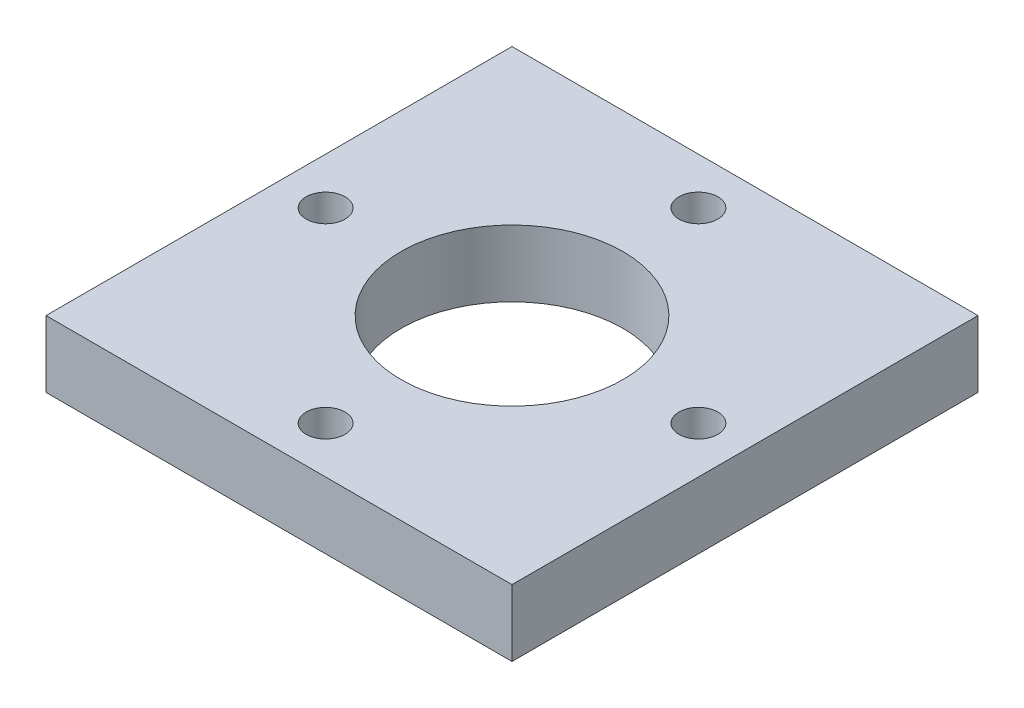
ISO-10303-21;
HEADER;
FILE_DESCRIPTION(('STEP AP214'),'2;1');
FILE_NAME('part.step','',(''),(''),'','','');
FILE_SCHEMA(('AUTOMOTIVE_DESIGN { 1 0 10303 214 1 1 1 1 }'));
ENDSEC;
DATA;
#1=APPLICATION_CONTEXT('core data for automotive mechanical design processes');
#2=APPLICATION_PROTOCOL_DEFINITION('international standard','automotive_design',2000,#1);
#3=PRODUCT_CONTEXT('',#1,'mechanical');
#4=PRODUCT('Part','Part','',(#3));
#5=PRODUCT_RELATED_PRODUCT_CATEGORY('part','',(#4));
#6=PRODUCT_DEFINITION_FORMATION('','',#4);
#7=PRODUCT_DEFINITION_CONTEXT('part definition',#1,'design');
#8=PRODUCT_DEFINITION('design','',#6,#7);
#9=PRODUCT_DEFINITION_SHAPE('','',#8);
#10=(LENGTH_UNIT() NAMED_UNIT(*) SI_UNIT(.MILLI.,.METRE.));
#11=(NAMED_UNIT(*) PLANE_ANGLE_UNIT() SI_UNIT($,.RADIAN.));
#12=(NAMED_UNIT(*) SI_UNIT($,.STERADIAN.) SOLID_ANGLE_UNIT());
#13=UNCERTAINTY_MEASURE_WITH_UNIT(LENGTH_MEASURE(1.E-05),#10,'distance_accuracy_value','');
#14=(GEOMETRIC_REPRESENTATION_CONTEXT(3) GLOBAL_UNCERTAINTY_ASSIGNED_CONTEXT((#13)) GLOBAL_UNIT_ASSIGNED_CONTEXT((#10,
#11,#12)) REPRESENTATION_CONTEXT('',''));
#15=CARTESIAN_POINT('',(0.,0.,0.));
#16=DIRECTION('',(0.,0.,1.));
#17=DIRECTION('',(1.,0.,0.));
#18=AXIS2_PLACEMENT_3D('',#15,#16,#17);
#19=CARTESIAN_POINT('',(0.,9.525,0.));
#20=DIRECTION('',(0.,-1.,0.));
#21=DIRECTION('',(0.,0.,-1.));
#22=AXIS2_PLACEMENT_3D('',#19,#20,#21);
#23=PLANE('',#22);
#24=CARTESIAN_POINT('',(1.5094817149911E-12,9.525,26.67));
#25=DIRECTION('',(0.,1.,0.));
#26=DIRECTION('',(0.,0.,1.));
#27=AXIS2_PLACEMENT_3D('',#24,#25,#26);
#28=CIRCLE('',#27,2.77876000000162);
#29=CARTESIAN_POINT('',(1.5094817149911E-12,9.525,23.8912399999984));
#30=VERTEX_POINT('',#29);
#31=EDGE_CURVE('E139',#30,#30,#28,.T.);
#32=ORIENTED_EDGE('',*,*,#31,.F.);
#33=EDGE_LOOP('',(#32));
#34=FACE_BOUND('',#33,.T.);
#35=CARTESIAN_POINT('',(0.,9.525,-26.67));
#36=DIRECTION('',(0.,1.,0.));
#37=DIRECTION('',(0.,0.,1.));
#38=AXIS2_PLACEMENT_3D('',#35,#36,#37);
#39=CIRCLE('',#38,2.77876);
#40=CARTESIAN_POINT('',(0.,9.525,-29.44876));
#41=VERTEX_POINT('',#40);
#42=EDGE_CURVE('E127',#41,#41,#39,.T.);
#43=ORIENTED_EDGE('',*,*,#42,.F.);
#44=EDGE_LOOP('',(#43));
#45=FACE_BOUND('',#44,.T.);
#46=DIRECTION('',(0.,0.,-1.));
#47=VECTOR('',#46,1.);
#48=CARTESIAN_POINT('',(33.3375,9.525,33.3375));
#49=LINE('',#48,#47);
#50=CARTESIAN_POINT('',(33.3375,9.525,33.3375));
#51=VERTEX_POINT('',#50);
#52=CARTESIAN_POINT('',(33.3375,9.525,-33.3375));
#53=VERTEX_POINT('',#52);
#54=EDGE_CURVE('E97',#51,#53,#49,.T.);
#55=ORIENTED_EDGE('',*,*,#54,.T.);
#56=DIRECTION('',(-1.,0.,0.));
#57=VECTOR('',#56,1.);
#58=CARTESIAN_POINT('',(-33.3375,9.525,-33.3375));
#59=LINE('',#58,#57);
#60=CARTESIAN_POINT('',(-33.3375,9.525,-33.3375));
#61=VERTEX_POINT('',#60);
#62=EDGE_CURVE('E92',#53,#61,#59,.T.);
#63=ORIENTED_EDGE('',*,*,#62,.T.);
#64=DIRECTION('',(0.,0.,1.));
#65=VECTOR('',#64,1.);
#66=CARTESIAN_POINT('',(-33.3375,9.525,33.3375));
#67=LINE('',#66,#65);
#68=CARTESIAN_POINT('',(-33.3375,9.525,33.3375));
#69=VERTEX_POINT('',#68);
#70=EDGE_CURVE('E95',#61,#69,#67,.T.);
#71=ORIENTED_EDGE('',*,*,#70,.T.);
#72=DIRECTION('',(1.,0.,0.));
#73=VECTOR('',#72,1.);
#74=CARTESIAN_POINT('',(-33.3375,9.525,33.3375));
#75=LINE('',#74,#73);
#76=EDGE_CURVE('E62',#69,#51,#75,.T.);
#77=ORIENTED_EDGE('',*,*,#76,.T.);
#78=EDGE_LOOP('',(#55,#63,#71,#77));
#79=FACE_BOUND('',#78,.T.);
#80=CARTESIAN_POINT('',(0.,9.525,0.));
#81=DIRECTION('',(0.,1.,0.));
#82=DIRECTION('',(0.,0.,1.));
#83=AXIS2_PLACEMENT_3D('',#80,#81,#82);
#84=CIRCLE('',#83,15.875);
#85=CARTESIAN_POINT('',(0.,9.525,-15.875));
#86=VERTEX_POINT('',#85);
#87=EDGE_CURVE('E112',#86,#86,#84,.T.);
#88=ORIENTED_EDGE('',*,*,#87,.F.);
#89=EDGE_LOOP('',(#88));
#90=FACE_BOUND('',#89,.T.);
#91=CARTESIAN_POINT('',(26.6700000000008,9.525,-7.54740857495549E-13));
#92=DIRECTION('',(0.,1.,0.));
#93=DIRECTION('',(0.,0.,1.));
#94=AXIS2_PLACEMENT_3D('',#91,#92,#93);
#95=CIRCLE('',#94,2.77876000000059);
#96=CARTESIAN_POINT('',(26.6700000000008,9.525,-2.77876000000134));
#97=VERTEX_POINT('',#96);
#98=EDGE_CURVE('E133',#97,#97,#95,.T.);
#99=ORIENTED_EDGE('',*,*,#98,.F.);
#100=EDGE_LOOP('',(#99));
#101=FACE_BOUND('',#100,.T.);
#102=CARTESIAN_POINT('',(-26.6699999999992,9.525,7.58006990508875E-13));
#103=DIRECTION('',(0.,1.,0.));
#104=DIRECTION('',(0.,0.,1.));
#105=AXIS2_PLACEMENT_3D('',#102,#103,#104);
#106=CIRCLE('',#105,2.77876000000121);
#107=CARTESIAN_POINT('',(-26.6699999999992,9.525,-2.77876000000046));
#108=VERTEX_POINT('',#107);
#109=EDGE_CURVE('E145',#108,#108,#106,.T.);
#110=ORIENTED_EDGE('',*,*,#109,.F.);
#111=EDGE_LOOP('',(#110));
#112=FACE_BOUND('',#111,.T.);
#113=ADVANCED_FACE('F45',(#34,#45,#79,#90,#101,#112),#23,.F.);
#114=CARTESIAN_POINT('',(0.,0.,0.));
#115=DIRECTION('',(0.,-1.,0.));
#116=DIRECTION('',(0.,0.,-1.));
#117=AXIS2_PLACEMENT_3D('',#114,#115,#116);
#118=PLANE('',#117);
#119=CARTESIAN_POINT('',(1.5094817149911E-12,0.,26.67));
#120=DIRECTION('',(0.,1.,0.));
#121=DIRECTION('',(0.,0.,1.));
#122=AXIS2_PLACEMENT_3D('',#119,#120,#121);
#123=CIRCLE('',#122,2.77876000000162);
#124=CARTESIAN_POINT('',(1.5094817149911E-12,0.,23.8912399999984));
#125=VERTEX_POINT('',#124);
#126=EDGE_CURVE('E142',#125,#125,#123,.T.);
#127=ORIENTED_EDGE('',*,*,#126,.T.);
#128=EDGE_LOOP('',(#127));
#129=FACE_BOUND('',#128,.T.);
#130=CARTESIAN_POINT('',(0.,0.,-26.67));
#131=DIRECTION('',(0.,1.,0.));
#132=DIRECTION('',(0.,0.,1.));
#133=AXIS2_PLACEMENT_3D('',#130,#131,#132);
#134=CIRCLE('',#133,2.77876);
#135=CARTESIAN_POINT('',(0.,0.,-29.44876));
#136=VERTEX_POINT('',#135);
#137=EDGE_CURVE('E130',#136,#136,#134,.T.);
#138=ORIENTED_EDGE('',*,*,#137,.T.);
#139=EDGE_LOOP('',(#138));
#140=FACE_BOUND('',#139,.T.);
#141=DIRECTION('',(0.,0.,-1.));
#142=VECTOR('',#141,1.);
#143=CARTESIAN_POINT('',(33.3375,0.,33.3375));
#144=LINE('',#143,#142);
#145=CARTESIAN_POINT('',(33.3375,0.,33.3375));
#146=VERTEX_POINT('',#145);
#147=CARTESIAN_POINT('',(33.3375,0.,-33.3375));
#148=VERTEX_POINT('',#147);
#149=EDGE_CURVE('E109',#146,#148,#144,.T.);
#150=ORIENTED_EDGE('',*,*,#149,.F.);
#151=DIRECTION('',(1.,0.,0.));
#152=VECTOR('',#151,1.);
#153=CARTESIAN_POINT('',(-33.3375,0.,33.3375));
#154=LINE('',#153,#152);
#155=CARTESIAN_POINT('',(-33.3375,0.,33.3375));
#156=VERTEX_POINT('',#155);
#157=EDGE_CURVE('E85',#156,#146,#154,.T.);
#158=ORIENTED_EDGE('',*,*,#157,.F.);
#159=DIRECTION('',(0.,0.,1.));
#160=VECTOR('',#159,1.);
#161=CARTESIAN_POINT('',(-33.3375,0.,33.3375));
#162=LINE('',#161,#160);
#163=CARTESIAN_POINT('',(-33.3375,0.,-33.3375));
#164=VERTEX_POINT('',#163);
#165=EDGE_CURVE('E79',#164,#156,#162,.T.);
#166=ORIENTED_EDGE('',*,*,#165,.F.);
#167=DIRECTION('',(-1.,0.,0.));
#168=VECTOR('',#167,1.);
#169=CARTESIAN_POINT('',(-33.3375,0.,-33.3375));
#170=LINE('',#169,#168);
#171=EDGE_CURVE('E101',#148,#164,#170,.T.);
#172=ORIENTED_EDGE('',*,*,#171,.F.);
#173=EDGE_LOOP('',(#150,#158,#166,#172));
#174=FACE_BOUND('',#173,.T.);
#175=CARTESIAN_POINT('',(0.,0.,0.));
#176=DIRECTION('',(0.,1.,0.));
#177=DIRECTION('',(0.,0.,1.));
#178=AXIS2_PLACEMENT_3D('',#175,#176,#177);
#179=CIRCLE('',#178,15.875);
#180=CARTESIAN_POINT('',(0.,0.,-15.875));
#181=VERTEX_POINT('',#180);
#182=EDGE_CURVE('E124',#181,#181,#179,.T.);
#183=ORIENTED_EDGE('',*,*,#182,.T.);
#184=EDGE_LOOP('',(#183));
#185=FACE_BOUND('',#184,.T.);
#186=CARTESIAN_POINT('',(26.6700000000008,0.,-7.54740857495549E-13));
#187=DIRECTION('',(0.,1.,0.));
#188=DIRECTION('',(0.,0.,1.));
#189=AXIS2_PLACEMENT_3D('',#186,#187,#188);
#190=CIRCLE('',#189,2.77876000000059);
#191=CARTESIAN_POINT('',(26.6700000000008,0.,-2.77876000000134));
#192=VERTEX_POINT('',#191);
#193=EDGE_CURVE('E136',#192,#192,#190,.T.);
#194=ORIENTED_EDGE('',*,*,#193,.T.);
#195=EDGE_LOOP('',(#194));
#196=FACE_BOUND('',#195,.T.);
#197=CARTESIAN_POINT('',(-26.6699999999992,0.,7.58006990508875E-13));
#198=DIRECTION('',(0.,1.,0.));
#199=DIRECTION('',(0.,0.,1.));
#200=AXIS2_PLACEMENT_3D('',#197,#198,#199);
#201=CIRCLE('',#200,2.77876000000121);
#202=CARTESIAN_POINT('',(-26.6699999999992,0.,-2.77876000000046));
#203=VERTEX_POINT('',#202);
#204=EDGE_CURVE('E148',#203,#203,#201,.T.);
#205=ORIENTED_EDGE('',*,*,#204,.T.);
#206=EDGE_LOOP('',(#205));
#207=FACE_BOUND('',#206,.T.);
#208=ADVANCED_FACE('F120',(#129,#140,#174,#185,#196,#207),#118,.T.);
#209=CARTESIAN_POINT('',(33.3375,9.525,33.3375));
#210=DIRECTION('',(-1.,0.,0.));
#211=DIRECTION('',(0.,0.,1.));
#212=AXIS2_PLACEMENT_3D('',#209,#210,#211);
#213=PLANE('',#212);
#214=ORIENTED_EDGE('',*,*,#149,.T.);
#215=DIRECTION('',(0.,-1.,0.));
#216=VECTOR('',#215,1.);
#217=CARTESIAN_POINT('',(33.3375,9.525,-33.3375));
#218=LINE('',#217,#216);
#219=EDGE_CURVE('E13',#53,#148,#218,.T.);
#220=ORIENTED_EDGE('',*,*,#219,.F.);
#221=ORIENTED_EDGE('',*,*,#54,.F.);
#222=DIRECTION('',(0.,-1.,0.));
#223=VECTOR('',#222,1.);
#224=CARTESIAN_POINT('',(33.3375,9.525,33.3375));
#225=LINE('',#224,#223);
#226=EDGE_CURVE('E105',#51,#146,#225,.T.);
#227=ORIENTED_EDGE('',*,*,#226,.T.);
#228=EDGE_LOOP('',(#214,#220,#221,#227));
#229=FACE_BOUND('',#228,.T.);
#230=ADVANCED_FACE('F47',(#229),#213,.F.);
#231=CARTESIAN_POINT('',(-33.3375,9.525,-33.3375));
#232=DIRECTION('',(0.,0.,1.));
#233=DIRECTION('',(1.,0.,0.));
#234=AXIS2_PLACEMENT_3D('',#231,#232,#233);
#235=PLANE('',#234);
#236=ORIENTED_EDGE('',*,*,#171,.T.);
#237=DIRECTION('',(0.,-1.,0.));
#238=VECTOR('',#237,1.);
#239=CARTESIAN_POINT('',(-33.3375,9.525,-33.3375));
#240=LINE('',#239,#238);
#241=EDGE_CURVE('E54',#61,#164,#240,.T.);
#242=ORIENTED_EDGE('',*,*,#241,.F.);
#243=ORIENTED_EDGE('',*,*,#62,.F.);
#244=ORIENTED_EDGE('',*,*,#219,.T.);
#245=EDGE_LOOP('',(#236,#242,#243,#244));
#246=FACE_BOUND('',#245,.T.);
#247=ADVANCED_FACE('F100',(#246),#235,.F.);
#248=CARTESIAN_POINT('',(-33.3375,9.525,33.3375));
#249=DIRECTION('',(1.,0.,0.));
#250=DIRECTION('',(0.,0.,-1.));
#251=AXIS2_PLACEMENT_3D('',#248,#249,#250);
#252=PLANE('',#251);
#253=ORIENTED_EDGE('',*,*,#165,.T.);
#254=DIRECTION('',(0.,-1.,0.));
#255=VECTOR('',#254,1.);
#256=CARTESIAN_POINT('',(-33.3375,9.525,33.3375));
#257=LINE('',#256,#255);
#258=EDGE_CURVE('E102',#69,#156,#257,.T.);
#259=ORIENTED_EDGE('',*,*,#258,.F.);
#260=ORIENTED_EDGE('',*,*,#70,.F.);
#261=ORIENTED_EDGE('',*,*,#241,.T.);
#262=EDGE_LOOP('',(#253,#259,#260,#261));
#263=FACE_BOUND('',#262,.T.);
#264=ADVANCED_FACE('F103',(#263),#252,.F.);
#265=CARTESIAN_POINT('',(-33.3375,9.525,33.3375));
#266=DIRECTION('',(0.,0.,-1.));
#267=DIRECTION('',(-1.,0.,0.));
#268=AXIS2_PLACEMENT_3D('',#265,#266,#267);
#269=PLANE('',#268);
#270=ORIENTED_EDGE('',*,*,#157,.T.);
#271=ORIENTED_EDGE('',*,*,#226,.F.);
#272=ORIENTED_EDGE('',*,*,#76,.F.);
#273=ORIENTED_EDGE('',*,*,#258,.T.);
#274=EDGE_LOOP('',(#270,#271,#272,#273));
#275=FACE_BOUND('',#274,.T.);
#276=ADVANCED_FACE('F117',(#275),#269,.F.);
#277=CARTESIAN_POINT('',(0.,9.525,0.));
#278=DIRECTION('',(0.,-1.,0.));
#279=DIRECTION('',(0.,0.,-1.));
#280=AXIS2_PLACEMENT_3D('',#277,#278,#279);
#281=CYLINDRICAL_SURFACE('',#280,15.875);
#282=CARTESIAN_POINT('',(0.,9.525,-15.875));
#283=CARTESIAN_POINT('',(0.,9.42578125,-15.875));
#284=CARTESIAN_POINT('',(0.,9.3265625,-15.875));
#285=CARTESIAN_POINT('',(0.,9.128125,-15.875));
#286=CARTESIAN_POINT('',(0.,9.02890625,-15.875));
#287=CARTESIAN_POINT('',(0.,8.83046875,-15.875));
#288=CARTESIAN_POINT('',(0.,8.73125,-15.875));
#289=CARTESIAN_POINT('',(0.,8.5328125,-15.875));
#290=CARTESIAN_POINT('',(0.,8.43359375,-15.875));
#291=CARTESIAN_POINT('',(0.,8.23515625,-15.875));
#292=CARTESIAN_POINT('',(0.,8.1359375,-15.875));
#293=CARTESIAN_POINT('',(0.,7.9375,-15.875));
#294=CARTESIAN_POINT('',(0.,7.83828125,-15.875));
#295=CARTESIAN_POINT('',(0.,7.63984375,-15.875));
#296=CARTESIAN_POINT('',(0.,7.540625,-15.875));
#297=CARTESIAN_POINT('',(0.,7.3421875,-15.875));
#298=CARTESIAN_POINT('',(0.,7.24296875,-15.875));
#299=CARTESIAN_POINT('',(0.,7.04453125,-15.875));
#300=CARTESIAN_POINT('',(0.,6.9453125,-15.875));
#301=CARTESIAN_POINT('',(0.,6.746875,-15.875));
#302=CARTESIAN_POINT('',(0.,6.64765625,-15.875));
#303=CARTESIAN_POINT('',(0.,6.44921875,-15.875));
#304=CARTESIAN_POINT('',(0.,6.35,-15.875));
#305=CARTESIAN_POINT('',(0.,6.1515625,-15.875));
#306=CARTESIAN_POINT('',(0.,6.05234375,-15.875));
#307=CARTESIAN_POINT('',(0.,5.85390625,-15.875));
#308=CARTESIAN_POINT('',(0.,5.7546875,-15.875));
#309=CARTESIAN_POINT('',(0.,5.55625,-15.875));
#310=CARTESIAN_POINT('',(0.,5.45703125,-15.875));
#311=CARTESIAN_POINT('',(0.,5.25859375,-15.875));
#312=CARTESIAN_POINT('',(0.,5.159375,-15.875));
#313=CARTESIAN_POINT('',(0.,4.9609375,-15.875));
#314=CARTESIAN_POINT('',(0.,4.86171875,-15.875));
#315=CARTESIAN_POINT('',(0.,4.66328125,-15.875));
#316=CARTESIAN_POINT('',(0.,4.5640625,-15.875));
#317=CARTESIAN_POINT('',(0.,4.365625,-15.875));
#318=CARTESIAN_POINT('',(0.,4.26640625,-15.875));
#319=CARTESIAN_POINT('',(0.,4.06796875,-15.875));
#320=CARTESIAN_POINT('',(0.,3.96875,-15.875));
#321=CARTESIAN_POINT('',(0.,3.7703125,-15.875));
#322=CARTESIAN_POINT('',(0.,3.67109375,-15.875));
#323=CARTESIAN_POINT('',(0.,3.47265625,-15.875));
#324=CARTESIAN_POINT('',(0.,3.3734375,-15.875));
#325=CARTESIAN_POINT('',(0.,3.175,-15.875));
#326=CARTESIAN_POINT('',(0.,3.07578125,-15.875));
#327=CARTESIAN_POINT('',(0.,2.87734375,-15.875));
#328=CARTESIAN_POINT('',(0.,2.778125,-15.875));
#329=CARTESIAN_POINT('',(0.,2.5796875,-15.875));
#330=CARTESIAN_POINT('',(0.,2.48046875,-15.875));
#331=CARTESIAN_POINT('',(0.,2.28203125,-15.875));
#332=CARTESIAN_POINT('',(0.,2.1828125,-15.875));
#333=CARTESIAN_POINT('',(0.,1.984375,-15.875));
#334=CARTESIAN_POINT('',(0.,1.88515625,-15.875));
#335=CARTESIAN_POINT('',(0.,1.68671875,-15.875));
#336=CARTESIAN_POINT('',(0.,1.5875,-15.875));
#337=CARTESIAN_POINT('',(0.,1.3890625,-15.875));
#338=CARTESIAN_POINT('',(0.,1.28984375,-15.875));
#339=CARTESIAN_POINT('',(0.,1.09140625,-15.875));
#340=CARTESIAN_POINT('',(0.,0.992187500000001,-15.875));
#341=CARTESIAN_POINT('',(0.,0.793750000000001,-15.875));
#342=CARTESIAN_POINT('',(0.,0.69453125,-15.875));
#343=CARTESIAN_POINT('',(0.,0.49609375,-15.875));
#344=CARTESIAN_POINT('',(0.,0.396875,-15.875));
#345=CARTESIAN_POINT('',(0.,0.1984375,-15.875));
#346=CARTESIAN_POINT('',(0.,0.0992187500000001,-15.875));
#347=CARTESIAN_POINT('',(0.,0.,-15.875));
#348=B_SPLINE_CURVE_WITH_KNOTS('',3,(#282,#283,#284,#285,#286,#287,#288,#289,#290,#291,#292,
#293,#294,#295,#296,#297,#298,#299,#300,#301,#302,#303,#304,#305,#306,#307,#308,#309,#310,#311,
#312,#313,#314,#315,#316,#317,#318,#319,#320,#321,#322,#323,#324,#325,#326,#327,#328,#329,#330,
#331,#332,#333,#334,#335,#336,#337,#338,#339,#340,#341,#342,#343,#344,#345,#346,#347),
.UNSPECIFIED.,.F.,.F.,(4,2,2,2,2,2,2,2,2,2,2,2,2,2,2,2,2,2,2,2,2,2,2,2,2,2,2,2,2,2,2,2,4),(0.,
0.297656249999998,0.595312499999999,0.892968749999999,1.190625,1.48828125,1.7859375,2.08359375,
2.38125,2.67890625,2.9765625,3.27421875,3.571875,3.86953125,4.1671875,4.46484375,4.7625,
5.06015625,5.3578125,5.65546875,5.953125,6.25078125,6.5484375,6.84609375,7.14375,7.44140625,
7.7390625,8.03671875,8.334375,8.63203125,8.9296875,9.22734375,9.525),.UNSPECIFIED.);
#349=EDGE_CURVE('BSEAM168',#86,#181,#348,.T.);
#350=ORIENTED_EDGE('',*,*,#87,.T.);
#351=ORIENTED_EDGE('',*,*,#182,.F.);
#352=ORIENTED_EDGE('',*,*,#349,.T.);
#353=ORIENTED_EDGE('',*,*,#349,.F.);
#354=EDGE_LOOP('',(#350,#352,#351,#353));
#355=FACE_BOUND('',#354,.T.);
#356=ADVANCED_FACE('F168',(#355),#281,.F.);
#357=CARTESIAN_POINT('',(0.,9.525,-26.67));
#358=DIRECTION('',(0.,-1.,0.));
#359=DIRECTION('',(0.,0.,-1.));
#360=AXIS2_PLACEMENT_3D('',#357,#358,#359);
#361=CYLINDRICAL_SURFACE('',#360,2.77876);
#362=CARTESIAN_POINT('',(0.,9.525,-29.44876));
#363=CARTESIAN_POINT('',(0.,9.42578125,-29.44876));
#364=CARTESIAN_POINT('',(0.,9.3265625,-29.44876));
#365=CARTESIAN_POINT('',(0.,9.128125,-29.44876));
#366=CARTESIAN_POINT('',(0.,9.02890625,-29.44876));
#367=CARTESIAN_POINT('',(0.,8.83046875,-29.44876));
#368=CARTESIAN_POINT('',(0.,8.73125,-29.44876));
#369=CARTESIAN_POINT('',(0.,8.5328125,-29.44876));
#370=CARTESIAN_POINT('',(0.,8.43359375,-29.44876));
#371=CARTESIAN_POINT('',(0.,8.23515625,-29.44876));
#372=CARTESIAN_POINT('',(0.,8.1359375,-29.44876));
#373=CARTESIAN_POINT('',(0.,7.9375,-29.44876));
#374=CARTESIAN_POINT('',(0.,7.83828125,-29.44876));
#375=CARTESIAN_POINT('',(0.,7.63984375,-29.44876));
#376=CARTESIAN_POINT('',(0.,7.540625,-29.44876));
#377=CARTESIAN_POINT('',(0.,7.3421875,-29.44876));
#378=CARTESIAN_POINT('',(0.,7.24296875,-29.44876));
#379=CARTESIAN_POINT('',(0.,7.04453125,-29.44876));
#380=CARTESIAN_POINT('',(0.,6.9453125,-29.44876));
#381=CARTESIAN_POINT('',(0.,6.746875,-29.44876));
#382=CARTESIAN_POINT('',(0.,6.64765625,-29.44876));
#383=CARTESIAN_POINT('',(0.,6.44921875,-29.44876));
#384=CARTESIAN_POINT('',(0.,6.35,-29.44876));
#385=CARTESIAN_POINT('',(0.,6.1515625,-29.44876));
#386=CARTESIAN_POINT('',(0.,6.05234375,-29.44876));
#387=CARTESIAN_POINT('',(0.,5.85390625,-29.44876));
#388=CARTESIAN_POINT('',(0.,5.7546875,-29.44876));
#389=CARTESIAN_POINT('',(0.,5.55625,-29.44876));
#390=CARTESIAN_POINT('',(0.,5.45703125,-29.44876));
#391=CARTESIAN_POINT('',(0.,5.25859375,-29.44876));
#392=CARTESIAN_POINT('',(0.,5.159375,-29.44876));
#393=CARTESIAN_POINT('',(0.,4.9609375,-29.44876));
#394=CARTESIAN_POINT('',(0.,4.86171875,-29.44876));
#395=CARTESIAN_POINT('',(0.,4.66328125,-29.44876));
#396=CARTESIAN_POINT('',(0.,4.5640625,-29.44876));
#397=CARTESIAN_POINT('',(0.,4.365625,-29.44876));
#398=CARTESIAN_POINT('',(0.,4.26640625,-29.44876));
#399=CARTESIAN_POINT('',(0.,4.06796875,-29.44876));
#400=CARTESIAN_POINT('',(0.,3.96875,-29.44876));
#401=CARTESIAN_POINT('',(0.,3.7703125,-29.44876));
#402=CARTESIAN_POINT('',(0.,3.67109375,-29.44876));
#403=CARTESIAN_POINT('',(0.,3.47265625,-29.44876));
#404=CARTESIAN_POINT('',(0.,3.3734375,-29.44876));
#405=CARTESIAN_POINT('',(0.,3.175,-29.44876));
#406=CARTESIAN_POINT('',(0.,3.07578125,-29.44876));
#407=CARTESIAN_POINT('',(0.,2.87734375,-29.44876));
#408=CARTESIAN_POINT('',(0.,2.778125,-29.44876));
#409=CARTESIAN_POINT('',(0.,2.5796875,-29.44876));
#410=CARTESIAN_POINT('',(0.,2.48046875,-29.44876));
#411=CARTESIAN_POINT('',(0.,2.28203125,-29.44876));
#412=CARTESIAN_POINT('',(0.,2.1828125,-29.44876));
#413=CARTESIAN_POINT('',(0.,1.984375,-29.44876));
#414=CARTESIAN_POINT('',(0.,1.88515625,-29.44876));
#415=CARTESIAN_POINT('',(0.,1.68671875,-29.44876));
#416=CARTESIAN_POINT('',(0.,1.5875,-29.44876));
#417=CARTESIAN_POINT('',(0.,1.3890625,-29.44876));
#418=CARTESIAN_POINT('',(0.,1.28984375,-29.44876));
#419=CARTESIAN_POINT('',(0.,1.09140625,-29.44876));
#420=CARTESIAN_POINT('',(0.,0.992187500000001,-29.44876));
#421=CARTESIAN_POINT('',(0.,0.793750000000001,-29.44876));
#422=CARTESIAN_POINT('',(0.,0.69453125,-29.44876));
#423=CARTESIAN_POINT('',(0.,0.49609375,-29.44876));
#424=CARTESIAN_POINT('',(0.,0.396875,-29.44876));
#425=CARTESIAN_POINT('',(0.,0.1984375,-29.44876));
#426=CARTESIAN_POINT('',(0.,0.0992187500000001,-29.44876));
#427=CARTESIAN_POINT('',(0.,0.,-29.44876));
#428=B_SPLINE_CURVE_WITH_KNOTS('',3,(#362,#363,#364,#365,#366,#367,#368,#369,#370,#371,#372,
#373,#374,#375,#376,#377,#378,#379,#380,#381,#382,#383,#384,#385,#386,#387,#388,#389,#390,#391,
#392,#393,#394,#395,#396,#397,#398,#399,#400,#401,#402,#403,#404,#405,#406,#407,#408,#409,#410,
#411,#412,#413,#414,#415,#416,#417,#418,#419,#420,#421,#422,#423,#424,#425,#426,#427),
.UNSPECIFIED.,.F.,.F.,(4,2,2,2,2,2,2,2,2,2,2,2,2,2,2,2,2,2,2,2,2,2,2,2,2,2,2,2,2,2,2,2,4),(0.,
0.29765625,0.5953125,0.892968750000001,1.190625,1.48828125,1.7859375,2.08359375,2.38125,
2.67890625,2.9765625,3.27421875,3.571875,3.86953125,4.1671875,4.46484375,4.7625,5.06015625,
5.3578125,5.65546875,5.953125,6.25078125,6.5484375,6.84609375,7.14375,7.44140625,7.7390625,
8.03671875,8.334375,8.63203125,8.9296875,9.22734375,9.525),.UNSPECIFIED.);
#429=EDGE_CURVE('BSEAM214',#41,#136,#428,.T.);
#430=ORIENTED_EDGE('',*,*,#42,.T.);
#431=ORIENTED_EDGE('',*,*,#137,.F.);
#432=ORIENTED_EDGE('',*,*,#429,.T.);
#433=ORIENTED_EDGE('',*,*,#429,.F.);
#434=EDGE_LOOP('',(#430,#432,#431,#433));
#435=FACE_BOUND('',#434,.T.);
#436=ADVANCED_FACE('F214',(#435),#361,.F.);
#437=CARTESIAN_POINT('',(26.6700000000008,9.525,-7.54740857495549E-13));
#438=DIRECTION('',(0.,-1.,0.));
#439=DIRECTION('',(0.,0.,-1.));
#440=AXIS2_PLACEMENT_3D('',#437,#438,#439);
#441=CYLINDRICAL_SURFACE('',#440,2.77876000000059);
#442=CARTESIAN_POINT('',(26.6700000000008,9.525,-2.77876000000134));
#443=CARTESIAN_POINT('',(26.6700000000008,9.42578125,-2.77876000000134));
#444=CARTESIAN_POINT('',(26.6700000000008,9.3265625,-2.77876000000134));
#445=CARTESIAN_POINT('',(26.6700000000008,9.128125,-2.77876000000134));
#446=CARTESIAN_POINT('',(26.6700000000008,9.02890625,-2.77876000000134));
#447=CARTESIAN_POINT('',(26.6700000000008,8.83046875,-2.77876000000134));
#448=CARTESIAN_POINT('',(26.6700000000008,8.73125,-2.77876000000134));
#449=CARTESIAN_POINT('',(26.6700000000008,8.5328125,-2.77876000000134));
#450=CARTESIAN_POINT('',(26.6700000000008,8.43359375,-2.77876000000134));
#451=CARTESIAN_POINT('',(26.6700000000008,8.23515625,-2.77876000000134));
#452=CARTESIAN_POINT('',(26.6700000000008,8.1359375,-2.77876000000134));
#453=CARTESIAN_POINT('',(26.6700000000008,7.9375,-2.77876000000134));
#454=CARTESIAN_POINT('',(26.6700000000008,7.83828125,-2.77876000000134));
#455=CARTESIAN_POINT('',(26.6700000000008,7.63984375,-2.77876000000134));
#456=CARTESIAN_POINT('',(26.6700000000008,7.540625,-2.77876000000134));
#457=CARTESIAN_POINT('',(26.6700000000008,7.3421875,-2.77876000000134));
#458=CARTESIAN_POINT('',(26.6700000000008,7.24296875,-2.77876000000134));
#459=CARTESIAN_POINT('',(26.6700000000008,7.04453125,-2.77876000000134));
#460=CARTESIAN_POINT('',(26.6700000000008,6.9453125,-2.77876000000134));
#461=CARTESIAN_POINT('',(26.6700000000008,6.746875,-2.77876000000134));
#462=CARTESIAN_POINT('',(26.6700000000008,6.64765625,-2.77876000000134));
#463=CARTESIAN_POINT('',(26.6700000000008,6.44921875,-2.77876000000134));
#464=CARTESIAN_POINT('',(26.6700000000008,6.35,-2.77876000000134));
#465=CARTESIAN_POINT('',(26.6700000000008,6.1515625,-2.77876000000134));
#466=CARTESIAN_POINT('',(26.6700000000008,6.05234375,-2.77876000000134));
#467=CARTESIAN_POINT('',(26.6700000000008,5.85390625,-2.77876000000134));
#468=CARTESIAN_POINT('',(26.6700000000008,5.7546875,-2.77876000000134));
#469=CARTESIAN_POINT('',(26.6700000000008,5.55625,-2.77876000000134));
#470=CARTESIAN_POINT('',(26.6700000000008,5.45703125,-2.77876000000134));
#471=CARTESIAN_POINT('',(26.6700000000008,5.25859375,-2.77876000000134));
#472=CARTESIAN_POINT('',(26.6700000000008,5.159375,-2.77876000000134));
#473=CARTESIAN_POINT('',(26.6700000000008,4.9609375,-2.77876000000134));
#474=CARTESIAN_POINT('',(26.6700000000008,4.86171875,-2.77876000000134));
#475=CARTESIAN_POINT('',(26.6700000000008,4.66328125,-2.77876000000134));
#476=CARTESIAN_POINT('',(26.6700000000008,4.5640625,-2.77876000000134));
#477=CARTESIAN_POINT('',(26.6700000000008,4.365625,-2.77876000000134));
#478=CARTESIAN_POINT('',(26.6700000000008,4.26640625,-2.77876000000134));
#479=CARTESIAN_POINT('',(26.6700000000008,4.06796875,-2.77876000000134));
#480=CARTESIAN_POINT('',(26.6700000000008,3.96875,-2.77876000000134));
#481=CARTESIAN_POINT('',(26.6700000000008,3.7703125,-2.77876000000134));
#482=CARTESIAN_POINT('',(26.6700000000008,3.67109375,-2.77876000000134));
#483=CARTESIAN_POINT('',(26.6700000000008,3.47265625,-2.77876000000134));
#484=CARTESIAN_POINT('',(26.6700000000008,3.3734375,-2.77876000000134));
#485=CARTESIAN_POINT('',(26.6700000000008,3.175,-2.77876000000134));
#486=CARTESIAN_POINT('',(26.6700000000008,3.07578125,-2.77876000000134));
#487=CARTESIAN_POINT('',(26.6700000000008,2.87734375,-2.77876000000134));
#488=CARTESIAN_POINT('',(26.6700000000008,2.778125,-2.77876000000134));
#489=CARTESIAN_POINT('',(26.6700000000008,2.5796875,-2.77876000000134));
#490=CARTESIAN_POINT('',(26.6700000000008,2.48046875,-2.77876000000134));
#491=CARTESIAN_POINT('',(26.6700000000008,2.28203125,-2.77876000000134));
#492=CARTESIAN_POINT('',(26.6700000000008,2.1828125,-2.77876000000134));
#493=CARTESIAN_POINT('',(26.6700000000008,1.984375,-2.77876000000134));
#494=CARTESIAN_POINT('',(26.6700000000008,1.88515625,-2.77876000000134));
#495=CARTESIAN_POINT('',(26.6700000000008,1.68671875,-2.77876000000134));
#496=CARTESIAN_POINT('',(26.6700000000008,1.5875,-2.77876000000134));
#497=CARTESIAN_POINT('',(26.6700000000008,1.3890625,-2.77876000000134));
#498=CARTESIAN_POINT('',(26.6700000000008,1.28984375,-2.77876000000134));
#499=CARTESIAN_POINT('',(26.6700000000008,1.09140625,-2.77876000000134));
#500=CARTESIAN_POINT('',(26.6700000000008,0.992187500000001,-2.77876000000134));
#501=CARTESIAN_POINT('',(26.6700000000008,0.793750000000001,-2.77876000000134));
#502=CARTESIAN_POINT('',(26.6700000000008,0.69453125,-2.77876000000134));
#503=CARTESIAN_POINT('',(26.6700000000008,0.49609375,-2.77876000000134));
#504=CARTESIAN_POINT('',(26.6700000000008,0.396875,-2.77876000000134));
#505=CARTESIAN_POINT('',(26.6700000000008,0.1984375,-2.77876000000134));
#506=CARTESIAN_POINT('',(26.6700000000008,0.0992187500000001,-2.77876000000134));
#507=CARTESIAN_POINT('',(26.6700000000008,0.,-2.77876000000134));
#508=B_SPLINE_CURVE_WITH_KNOTS('',3,(#442,#443,#444,#445,#446,#447,#448,#449,#450,#451,#452,
#453,#454,#455,#456,#457,#458,#459,#460,#461,#462,#463,#464,#465,#466,#467,#468,#469,#470,#471,
#472,#473,#474,#475,#476,#477,#478,#479,#480,#481,#482,#483,#484,#485,#486,#487,#488,#489,#490,
#491,#492,#493,#494,#495,#496,#497,#498,#499,#500,#501,#502,#503,#504,#505,#506,#507),
.UNSPECIFIED.,.F.,.F.,(4,2,2,2,2,2,2,2,2,2,2,2,2,2,2,2,2,2,2,2,2,2,2,2,2,2,2,2,2,2,2,2,4),(0.,
0.29765625,0.5953125,0.892968750000001,1.190625,1.48828125,1.7859375,2.08359375,2.38125,
2.67890625,2.9765625,3.27421875,3.571875,3.86953125,4.1671875,4.46484375,4.7625,5.06015625,
5.3578125,5.65546875,5.953125,6.25078125,6.5484375,6.84609375,7.14375,7.44140625,7.7390625,
8.03671875,8.334375,8.63203125,8.9296875,9.22734375,9.525),.UNSPECIFIED.);
#509=EDGE_CURVE('BSEAM222',#97,#192,#508,.T.);
#510=ORIENTED_EDGE('',*,*,#98,.T.);
#511=ORIENTED_EDGE('',*,*,#193,.F.);
#512=ORIENTED_EDGE('',*,*,#509,.T.);
#513=ORIENTED_EDGE('',*,*,#509,.F.);
#514=EDGE_LOOP('',(#510,#512,#511,#513));
#515=FACE_BOUND('',#514,.T.);
#516=ADVANCED_FACE('F222',(#515),#441,.F.);
#517=CARTESIAN_POINT('',(1.5094817149911E-12,9.525,26.67));
#518=DIRECTION('',(0.,-1.,0.));
#519=DIRECTION('',(0.,0.,-1.));
#520=AXIS2_PLACEMENT_3D('',#517,#518,#519);
#521=CYLINDRICAL_SURFACE('',#520,2.77876000000162);
#522=CARTESIAN_POINT('',(1.5094817149911E-12,9.525,23.8912399999984));
#523=CARTESIAN_POINT('',(1.5094817149911E-12,9.42578125,23.8912399999984));
#524=CARTESIAN_POINT('',(1.5094817149911E-12,9.3265625,23.8912399999984));
#525=CARTESIAN_POINT('',(1.5094817149911E-12,9.128125,23.8912399999984));
#526=CARTESIAN_POINT('',(1.5094817149911E-12,9.02890625,23.8912399999984));
#527=CARTESIAN_POINT('',(1.5094817149911E-12,8.83046875,23.8912399999984));
#528=CARTESIAN_POINT('',(1.5094817149911E-12,8.73125,23.8912399999984));
#529=CARTESIAN_POINT('',(1.5094817149911E-12,8.5328125,23.8912399999984));
#530=CARTESIAN_POINT('',(1.5094817149911E-12,8.43359375,23.8912399999984));
#531=CARTESIAN_POINT('',(1.5094817149911E-12,8.23515625,23.8912399999984));
#532=CARTESIAN_POINT('',(1.5094817149911E-12,8.1359375,23.8912399999984));
#533=CARTESIAN_POINT('',(1.5094817149911E-12,7.9375,23.8912399999984));
#534=CARTESIAN_POINT('',(1.5094817149911E-12,7.83828125,23.8912399999984));
#535=CARTESIAN_POINT('',(1.5094817149911E-12,7.63984375,23.8912399999984));
#536=CARTESIAN_POINT('',(1.5094817149911E-12,7.540625,23.8912399999984));
#537=CARTESIAN_POINT('',(1.5094817149911E-12,7.3421875,23.8912399999984));
#538=CARTESIAN_POINT('',(1.5094817149911E-12,7.24296875,23.8912399999984));
#539=CARTESIAN_POINT('',(1.5094817149911E-12,7.04453125,23.8912399999984));
#540=CARTESIAN_POINT('',(1.5094817149911E-12,6.9453125,23.8912399999984));
#541=CARTESIAN_POINT('',(1.5094817149911E-12,6.746875,23.8912399999984));
#542=CARTESIAN_POINT('',(1.5094817149911E-12,6.64765625,23.8912399999984));
#543=CARTESIAN_POINT('',(1.5094817149911E-12,6.44921875,23.8912399999984));
#544=CARTESIAN_POINT('',(1.5094817149911E-12,6.35,23.8912399999984));
#545=CARTESIAN_POINT('',(1.5094817149911E-12,6.1515625,23.8912399999984));
#546=CARTESIAN_POINT('',(1.5094817149911E-12,6.05234375,23.8912399999984));
#547=CARTESIAN_POINT('',(1.5094817149911E-12,5.85390625,23.8912399999984));
#548=CARTESIAN_POINT('',(1.5094817149911E-12,5.7546875,23.8912399999984));
#549=CARTESIAN_POINT('',(1.5094817149911E-12,5.55625,23.8912399999984));
#550=CARTESIAN_POINT('',(1.5094817149911E-12,5.45703125,23.8912399999984));
#551=CARTESIAN_POINT('',(1.5094817149911E-12,5.25859375,23.8912399999984));
#552=CARTESIAN_POINT('',(1.5094817149911E-12,5.159375,23.8912399999984));
#553=CARTESIAN_POINT('',(1.5094817149911E-12,4.9609375,23.8912399999984));
#554=CARTESIAN_POINT('',(1.5094817149911E-12,4.86171875,23.8912399999984));
#555=CARTESIAN_POINT('',(1.5094817149911E-12,4.66328125,23.8912399999984));
#556=CARTESIAN_POINT('',(1.5094817149911E-12,4.5640625,23.8912399999984));
#557=CARTESIAN_POINT('',(1.5094817149911E-12,4.365625,23.8912399999984));
#558=CARTESIAN_POINT('',(1.5094817149911E-12,4.26640625,23.8912399999984));
#559=CARTESIAN_POINT('',(1.5094817149911E-12,4.06796875,23.8912399999984));
#560=CARTESIAN_POINT('',(1.5094817149911E-12,3.96875,23.8912399999984));
#561=CARTESIAN_POINT('',(1.5094817149911E-12,3.7703125,23.8912399999984));
#562=CARTESIAN_POINT('',(1.5094817149911E-12,3.67109375,23.8912399999984));
#563=CARTESIAN_POINT('',(1.5094817149911E-12,3.47265625,23.8912399999984));
#564=CARTESIAN_POINT('',(1.5094817149911E-12,3.3734375,23.8912399999984));
#565=CARTESIAN_POINT('',(1.5094817149911E-12,3.175,23.8912399999984));
#566=CARTESIAN_POINT('',(1.5094817149911E-12,3.07578125,23.8912399999984));
#567=CARTESIAN_POINT('',(1.5094817149911E-12,2.87734375,23.8912399999984));
#568=CARTESIAN_POINT('',(1.5094817149911E-12,2.778125,23.8912399999984));
#569=CARTESIAN_POINT('',(1.5094817149911E-12,2.5796875,23.8912399999984));
#570=CARTESIAN_POINT('',(1.5094817149911E-12,2.48046875,23.8912399999984));
#571=CARTESIAN_POINT('',(1.5094817149911E-12,2.28203125,23.8912399999984));
#572=CARTESIAN_POINT('',(1.5094817149911E-12,2.1828125,23.8912399999984));
#573=CARTESIAN_POINT('',(1.5094817149911E-12,1.984375,23.8912399999984));
#574=CARTESIAN_POINT('',(1.5094817149911E-12,1.88515625,23.8912399999984));
#575=CARTESIAN_POINT('',(1.5094817149911E-12,1.68671875,23.8912399999984));
#576=CARTESIAN_POINT('',(1.5094817149911E-12,1.5875,23.8912399999984));
#577=CARTESIAN_POINT('',(1.5094817149911E-12,1.3890625,23.8912399999984));
#578=CARTESIAN_POINT('',(1.5094817149911E-12,1.28984375,23.8912399999984));
#579=CARTESIAN_POINT('',(1.5094817149911E-12,1.09140625,23.8912399999984));
#580=CARTESIAN_POINT('',(1.5094817149911E-12,0.992187500000001,23.8912399999984));
#581=CARTESIAN_POINT('',(1.5094817149911E-12,0.793750000000001,23.8912399999984));
#582=CARTESIAN_POINT('',(1.5094817149911E-12,0.69453125,23.8912399999984));
#583=CARTESIAN_POINT('',(1.5094817149911E-12,0.49609375,23.8912399999984));
#584=CARTESIAN_POINT('',(1.5094817149911E-12,0.396875,23.8912399999984));
#585=CARTESIAN_POINT('',(1.5094817149911E-12,0.1984375,23.8912399999984));
#586=CARTESIAN_POINT('',(1.5094817149911E-12,0.0992187500000001,23.8912399999984));
#587=CARTESIAN_POINT('',(1.5094817149911E-12,0.,23.8912399999984));
#588=B_SPLINE_CURVE_WITH_KNOTS('',3,(#522,#523,#524,#525,#526,#527,#528,#529,#530,#531,#532,
#533,#534,#535,#536,#537,#538,#539,#540,#541,#542,#543,#544,#545,#546,#547,#548,#549,#550,#551,
#552,#553,#554,#555,#556,#557,#558,#559,#560,#561,#562,#563,#564,#565,#566,#567,#568,#569,#570,
#571,#572,#573,#574,#575,#576,#577,#578,#579,#580,#581,#582,#583,#584,#585,#586,#587),
.UNSPECIFIED.,.F.,.F.,(4,2,2,2,2,2,2,2,2,2,2,2,2,2,2,2,2,2,2,2,2,2,2,2,2,2,2,2,2,2,2,2,4),(0.,
0.29765625,0.5953125,0.892968750000001,1.190625,1.48828125,1.7859375,2.08359375,2.38125,
2.67890625,2.9765625,3.27421875,3.571875,3.86953125,4.1671875,4.46484375,4.7625,5.06015625,
5.3578125,5.65546875,5.953125,6.25078125,6.5484375,6.84609375,7.14375,7.44140625,7.7390625,
8.03671875,8.334375,8.63203125,8.9296875,9.22734375,9.525),.UNSPECIFIED.);
#589=EDGE_CURVE('BSEAM230',#30,#125,#588,.T.);
#590=ORIENTED_EDGE('',*,*,#31,.T.);
#591=ORIENTED_EDGE('',*,*,#126,.F.);
#592=ORIENTED_EDGE('',*,*,#589,.T.);
#593=ORIENTED_EDGE('',*,*,#589,.F.);
#594=EDGE_LOOP('',(#590,#592,#591,#593));
#595=FACE_BOUND('',#594,.T.);
#596=ADVANCED_FACE('F230',(#595),#521,.F.);
#597=CARTESIAN_POINT('',(-26.6699999999992,9.525,7.58006990508875E-13));
#598=DIRECTION('',(0.,-1.,0.));
#599=DIRECTION('',(0.,0.,-1.));
#600=AXIS2_PLACEMENT_3D('',#597,#598,#599);
#601=CYLINDRICAL_SURFACE('',#600,2.77876000000121);
#602=CARTESIAN_POINT('',(-26.6699999999992,9.525,-2.77876000000046));
#603=CARTESIAN_POINT('',(-26.6699999999992,9.42578125,-2.77876000000046));
#604=CARTESIAN_POINT('',(-26.6699999999992,9.3265625,-2.77876000000046));
#605=CARTESIAN_POINT('',(-26.6699999999992,9.128125,-2.77876000000046));
#606=CARTESIAN_POINT('',(-26.6699999999992,9.02890625,-2.77876000000046));
#607=CARTESIAN_POINT('',(-26.6699999999992,8.83046875,-2.77876000000046));
#608=CARTESIAN_POINT('',(-26.6699999999992,8.73125,-2.77876000000046));
#609=CARTESIAN_POINT('',(-26.6699999999992,8.5328125,-2.77876000000046));
#610=CARTESIAN_POINT('',(-26.6699999999992,8.43359375,-2.77876000000046));
#611=CARTESIAN_POINT('',(-26.6699999999992,8.23515625,-2.77876000000046));
#612=CARTESIAN_POINT('',(-26.6699999999992,8.1359375,-2.77876000000046));
#613=CARTESIAN_POINT('',(-26.6699999999992,7.9375,-2.77876000000046));
#614=CARTESIAN_POINT('',(-26.6699999999992,7.83828125,-2.77876000000046));
#615=CARTESIAN_POINT('',(-26.6699999999992,7.63984375,-2.77876000000046));
#616=CARTESIAN_POINT('',(-26.6699999999992,7.540625,-2.77876000000046));
#617=CARTESIAN_POINT('',(-26.6699999999992,7.3421875,-2.77876000000046));
#618=CARTESIAN_POINT('',(-26.6699999999992,7.24296875,-2.77876000000046));
#619=CARTESIAN_POINT('',(-26.6699999999992,7.04453125,-2.77876000000046));
#620=CARTESIAN_POINT('',(-26.6699999999992,6.9453125,-2.77876000000046));
#621=CARTESIAN_POINT('',(-26.6699999999992,6.746875,-2.77876000000046));
#622=CARTESIAN_POINT('',(-26.6699999999992,6.64765625,-2.77876000000046));
#623=CARTESIAN_POINT('',(-26.6699999999992,6.44921875,-2.77876000000046));
#624=CARTESIAN_POINT('',(-26.6699999999992,6.35,-2.77876000000046));
#625=CARTESIAN_POINT('',(-26.6699999999992,6.1515625,-2.77876000000046));
#626=CARTESIAN_POINT('',(-26.6699999999992,6.05234375,-2.77876000000046));
#627=CARTESIAN_POINT('',(-26.6699999999992,5.85390625,-2.77876000000046));
#628=CARTESIAN_POINT('',(-26.6699999999992,5.7546875,-2.77876000000046));
#629=CARTESIAN_POINT('',(-26.6699999999992,5.55625,-2.77876000000046));
#630=CARTESIAN_POINT('',(-26.6699999999992,5.45703125,-2.77876000000046));
#631=CARTESIAN_POINT('',(-26.6699999999992,5.25859375,-2.77876000000046));
#632=CARTESIAN_POINT('',(-26.6699999999992,5.159375,-2.77876000000046));
#633=CARTESIAN_POINT('',(-26.6699999999992,4.9609375,-2.77876000000046));
#634=CARTESIAN_POINT('',(-26.6699999999992,4.86171875,-2.77876000000046));
#635=CARTESIAN_POINT('',(-26.6699999999992,4.66328125,-2.77876000000046));
#636=CARTESIAN_POINT('',(-26.6699999999992,4.5640625,-2.77876000000046));
#637=CARTESIAN_POINT('',(-26.6699999999992,4.365625,-2.77876000000046));
#638=CARTESIAN_POINT('',(-26.6699999999992,4.26640625,-2.77876000000046));
#639=CARTESIAN_POINT('',(-26.6699999999992,4.06796875,-2.77876000000046));
#640=CARTESIAN_POINT('',(-26.6699999999992,3.96875,-2.77876000000046));
#641=CARTESIAN_POINT('',(-26.6699999999992,3.7703125,-2.77876000000046));
#642=CARTESIAN_POINT('',(-26.6699999999992,3.67109375,-2.77876000000046));
#643=CARTESIAN_POINT('',(-26.6699999999992,3.47265625,-2.77876000000046));
#644=CARTESIAN_POINT('',(-26.6699999999992,3.3734375,-2.77876000000046));
#645=CARTESIAN_POINT('',(-26.6699999999992,3.175,-2.77876000000046));
#646=CARTESIAN_POINT('',(-26.6699999999992,3.07578125,-2.77876000000046));
#647=CARTESIAN_POINT('',(-26.6699999999992,2.87734375,-2.77876000000046));
#648=CARTESIAN_POINT('',(-26.6699999999992,2.778125,-2.77876000000046));
#649=CARTESIAN_POINT('',(-26.6699999999992,2.5796875,-2.77876000000046));
#650=CARTESIAN_POINT('',(-26.6699999999992,2.48046875,-2.77876000000046));
#651=CARTESIAN_POINT('',(-26.6699999999992,2.28203125,-2.77876000000046));
#652=CARTESIAN_POINT('',(-26.6699999999992,2.1828125,-2.77876000000046));
#653=CARTESIAN_POINT('',(-26.6699999999992,1.984375,-2.77876000000046));
#654=CARTESIAN_POINT('',(-26.6699999999992,1.88515625,-2.77876000000046));
#655=CARTESIAN_POINT('',(-26.6699999999992,1.68671875,-2.77876000000046));
#656=CARTESIAN_POINT('',(-26.6699999999992,1.5875,-2.77876000000046));
#657=CARTESIAN_POINT('',(-26.6699999999992,1.3890625,-2.77876000000046));
#658=CARTESIAN_POINT('',(-26.6699999999992,1.28984375,-2.77876000000046));
#659=CARTESIAN_POINT('',(-26.6699999999992,1.09140625,-2.77876000000046));
#660=CARTESIAN_POINT('',(-26.6699999999992,0.992187500000001,-2.77876000000046));
#661=CARTESIAN_POINT('',(-26.6699999999992,0.793750000000001,-2.77876000000046));
#662=CARTESIAN_POINT('',(-26.6699999999992,0.69453125,-2.77876000000046));
#663=CARTESIAN_POINT('',(-26.6699999999992,0.49609375,-2.77876000000046));
#664=CARTESIAN_POINT('',(-26.6699999999992,0.396875,-2.77876000000046));
#665=CARTESIAN_POINT('',(-26.6699999999992,0.1984375,-2.77876000000046));
#666=CARTESIAN_POINT('',(-26.6699999999992,0.0992187500000001,-2.77876000000046));
#667=CARTESIAN_POINT('',(-26.6699999999992,0.,-2.77876000000046));
#668=B_SPLINE_CURVE_WITH_KNOTS('',3,(#602,#603,#604,#605,#606,#607,#608,#609,#610,#611,#612,
#613,#614,#615,#616,#617,#618,#619,#620,#621,#622,#623,#624,#625,#626,#627,#628,#629,#630,#631,
#632,#633,#634,#635,#636,#637,#638,#639,#640,#641,#642,#643,#644,#645,#646,#647,#648,#649,#650,
#651,#652,#653,#654,#655,#656,#657,#658,#659,#660,#661,#662,#663,#664,#665,#666,#667),
.UNSPECIFIED.,.F.,.F.,(4,2,2,2,2,2,2,2,2,2,2,2,2,2,2,2,2,2,2,2,2,2,2,2,2,2,2,2,2,2,2,2,4),(0.,
0.29765625,0.5953125,0.892968750000001,1.190625,1.48828125,1.7859375,2.08359375,2.38125,
2.67890625,2.9765625,3.27421875,3.571875,3.86953125,4.1671875,4.46484375,4.7625,5.06015625,
5.3578125,5.65546875,5.953125,6.25078125,6.5484375,6.84609375,7.14375,7.44140625,7.7390625,
8.03671875,8.334375,8.63203125,8.9296875,9.22734375,9.525),.UNSPECIFIED.);
#669=EDGE_CURVE('BSEAM154',#108,#203,#668,.T.);
#670=ORIENTED_EDGE('',*,*,#109,.T.);
#671=ORIENTED_EDGE('',*,*,#204,.F.);
#672=ORIENTED_EDGE('',*,*,#669,.T.);
#673=ORIENTED_EDGE('',*,*,#669,.F.);
#674=EDGE_LOOP('',(#670,#672,#671,#673));
#675=FACE_BOUND('',#674,.T.);
#676=ADVANCED_FACE('F154',(#675),#601,.F.);
#677=CLOSED_SHELL('',(#113,#208,#230,#247,#264,#276,#356,#436,#516,#596,#676));
#678=MANIFOLD_SOLID_BREP('B2',#677);
#679=ADVANCED_BREP_SHAPE_REPRESENTATION('',(#18,#678),#14);
#680=SHAPE_DEFINITION_REPRESENTATION(#9,#679);
ENDSEC;
END-ISO-10303-21;
